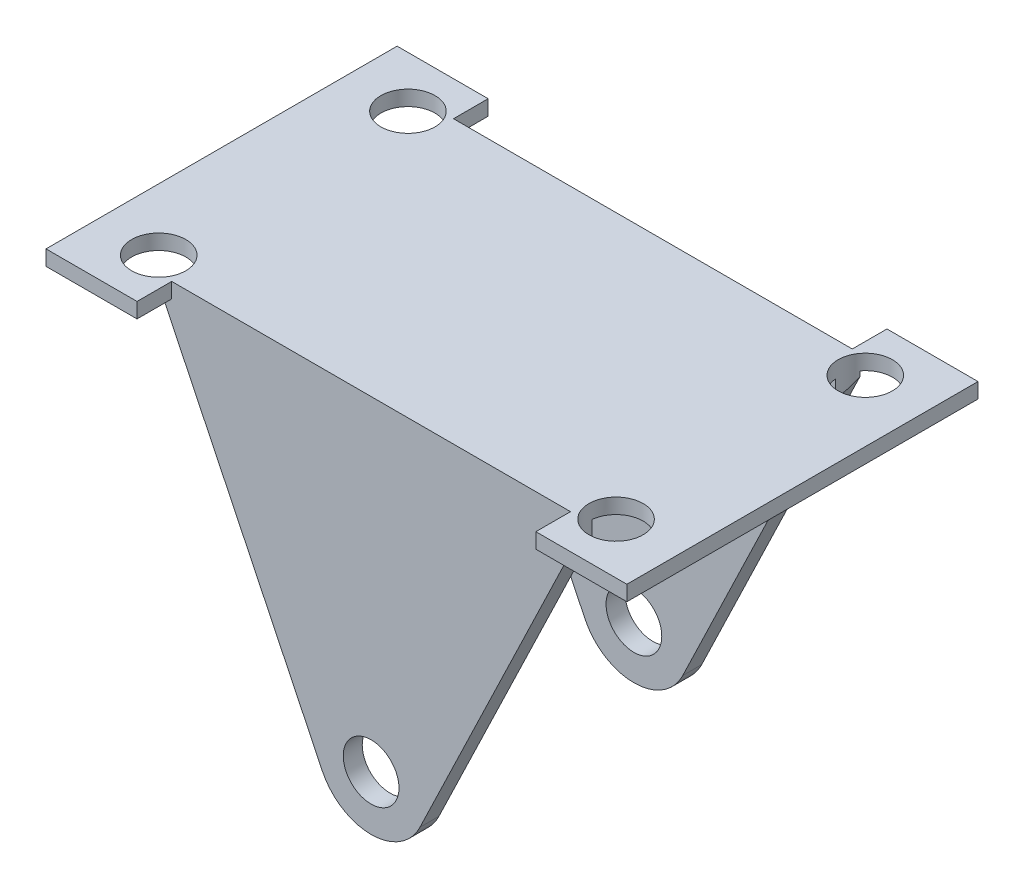
ISO-10303-21;
HEADER;
FILE_DESCRIPTION(('STEP AP214'),'2;1');
FILE_NAME('part.step','',(''),(''),'','','');
FILE_SCHEMA(('AUTOMOTIVE_DESIGN { 1 0 10303 214 1 1 1 1 }'));
ENDSEC;
DATA;
#1=APPLICATION_CONTEXT('core data for automotive mechanical design processes');
#2=APPLICATION_PROTOCOL_DEFINITION('international standard','automotive_design',2000,#1);
#3=PRODUCT_CONTEXT('',#1,'mechanical');
#4=PRODUCT('Part','Part','',(#3));
#5=PRODUCT_RELATED_PRODUCT_CATEGORY('part','',(#4));
#6=PRODUCT_DEFINITION_FORMATION('','',#4);
#7=PRODUCT_DEFINITION_CONTEXT('part definition',#1,'design');
#8=PRODUCT_DEFINITION('design','',#6,#7);
#9=PRODUCT_DEFINITION_SHAPE('','',#8);
#10=(LENGTH_UNIT() NAMED_UNIT(*) SI_UNIT(.MILLI.,.METRE.));
#11=(NAMED_UNIT(*) PLANE_ANGLE_UNIT() SI_UNIT($,.RADIAN.));
#12=(NAMED_UNIT(*) SI_UNIT($,.STERADIAN.) SOLID_ANGLE_UNIT());
#13=UNCERTAINTY_MEASURE_WITH_UNIT(LENGTH_MEASURE(1.E-05),#10,'distance_accuracy_value','');
#14=(GEOMETRIC_REPRESENTATION_CONTEXT(3) GLOBAL_UNCERTAINTY_ASSIGNED_CONTEXT((#13)) GLOBAL_UNIT_ASSIGNED_CONTEXT((#10,
#11,#12)) REPRESENTATION_CONTEXT('',''));
#15=CARTESIAN_POINT('',(0.,0.,0.));
#16=DIRECTION('',(0.,0.,1.));
#17=DIRECTION('',(1.,0.,0.));
#18=AXIS2_PLACEMENT_3D('',#15,#16,#17);
#19=CARTESIAN_POINT('',(-25.4,19.05,16.51));
#20=DIRECTION('',(0.900934049447252,0.433956032964834,0.));
#21=DIRECTION('',(-0.433956032964834,0.900934049447252,0.));
#22=AXIS2_PLACEMENT_3D('',#19,#20,#21);
#23=PLANE('',#22);
#24=DIRECTION('',(-0.433956032964834,0.900934049447252,0.));
#25=VECTOR('',#24,1.);
#26=CARTESIAN_POINT('',(-25.4,19.05,14.2875));
#27=LINE('',#26,#25);
#28=CARTESIAN_POINT('',(-5.72093121399006,-21.8056208093267,14.2875));
#29=VERTEX_POINT('',#28);
#30=CARTESIAN_POINT('',(-23.6377976710924,15.3915001531808,14.2875));
#31=VERTEX_POINT('',#30);
#32=EDGE_CURVE('E213',#29,#31,#27,.T.);
#33=ORIENTED_EDGE('',*,*,#32,.F.);
#34=DIRECTION('',(0.,0.,-1.));
#35=VECTOR('',#34,1.);
#36=CARTESIAN_POINT('',(-5.72093121399006,-21.8056208093267,16.51));
#37=LINE('',#36,#35);
#38=CARTESIAN_POINT('',(-5.72093121399006,-21.8056208093267,16.51));
#39=VERTEX_POINT('',#38);
#40=EDGE_CURVE('E383',#39,#29,#37,.T.);
#41=ORIENTED_EDGE('',*,*,#40,.F.);
#42=DIRECTION('',(0.433956032964834,-0.900934049447252,0.));
#43=VECTOR('',#42,1.);
#44=CARTESIAN_POINT('',(-25.4,19.05,16.51));
#45=LINE('',#44,#43);
#46=CARTESIAN_POINT('',(-24.2578767629152,16.67884339705,16.51));
#47=VERTEX_POINT('',#46);
#48=EDGE_CURVE('E359',#47,#39,#45,.T.);
#49=ORIENTED_EDGE('',*,*,#48,.F.);
#50=CARTESIAN_POINT('',(-26.797,21.9503050343117,14.6038315428861));
#51=DIRECTION('',(0.900934049447252,0.433956032964834,0.));
#52=DIRECTION('',(-0.433956032964834,0.900934049447252,0.));
#53=AXIS2_PLACEMENT_3D('',#50,#51,#52);
#54=ELLIPSE('',#53,7.31640940283294,3.17499999999999);
#55=EDGE_CURVE('E250',#47,#31,#54,.T.);
#56=ORIENTED_EDGE('',*,*,#55,.T.);
#57=EDGE_LOOP('',(#33,#41,#49,#56));
#58=FACE_BOUND('',#57,.T.);
#59=ADVANCED_FACE('F34',(#58),#23,.F.);
#60=CARTESIAN_POINT('',(0.,-19.05,16.51));
#61=DIRECTION('',(0.,0.,-1.));
#62=DIRECTION('',(-1.,0.,0.));
#63=AXIS2_PLACEMENT_3D('',#60,#61,#62);
#64=CYLINDRICAL_SURFACE('',#63,6.35);
#65=CARTESIAN_POINT('',(0.,-19.05,14.2875));
#66=DIRECTION('',(0.,0.,-1.));
#67=DIRECTION('',(-1.,0.,0.));
#68=AXIS2_PLACEMENT_3D('',#65,#66,#67);
#69=CIRCLE('',#68,6.35);
#70=CARTESIAN_POINT('',(5.72093121399004,-21.8056208093267,14.2875));
#71=VERTEX_POINT('',#70);
#72=EDGE_CURVE('E232',#71,#29,#69,.T.);
#73=ORIENTED_EDGE('',*,*,#72,.F.);
#74=DIRECTION('',(0.,0.,-1.));
#75=VECTOR('',#74,1.);
#76=CARTESIAN_POINT('',(5.72093121399004,-21.8056208093267,16.51));
#77=LINE('',#76,#75);
#78=CARTESIAN_POINT('',(5.72093121399004,-21.8056208093267,16.51));
#79=VERTEX_POINT('',#78);
#80=EDGE_CURVE('E379',#79,#71,#77,.T.);
#81=ORIENTED_EDGE('',*,*,#80,.F.);
#82=CARTESIAN_POINT('',(0.,-19.05,16.51));
#83=DIRECTION('',(0.,0.,1.));
#84=DIRECTION('',(1.,0.,0.));
#85=AXIS2_PLACEMENT_3D('',#82,#83,#84);
#86=CIRCLE('',#85,6.35);
#87=EDGE_CURVE('E362',#39,#79,#86,.T.);
#88=ORIENTED_EDGE('',*,*,#87,.F.);
#89=ORIENTED_EDGE('',*,*,#40,.T.);
#90=EDGE_LOOP('',(#73,#81,#88,#89));
#91=FACE_BOUND('',#90,.T.);
#92=ADVANCED_FACE('F459',(#91),#64,.T.);
#93=CARTESIAN_POINT('',(5.72093121399004,-21.8056208093267,16.51));
#94=DIRECTION('',(-0.900934049447252,0.433956032964835,0.));
#95=DIRECTION('',(-0.433956032964835,-0.900934049447252,0.));
#96=AXIS2_PLACEMENT_3D('',#93,#94,#95);
#97=PLANE('',#96);
#98=DIRECTION('',(-0.433956032964835,-0.900934049447252,0.));
#99=VECTOR('',#98,1.);
#100=CARTESIAN_POINT('',(5.72093121399004,-21.8056208093267,14.2875));
#101=LINE('',#100,#99);
#102=CARTESIAN_POINT('',(23.6377976710924,15.3915001531808,14.2875));
#103=VERTEX_POINT('',#102);
#104=EDGE_CURVE('E234',#103,#71,#101,.T.);
#105=ORIENTED_EDGE('',*,*,#104,.F.);
#106=CARTESIAN_POINT('',(26.797,21.9503050343116,14.6038315428861));
#107=DIRECTION('',(-0.900934049447252,0.433956032964835,0.));
#108=DIRECTION('',(0.433956032964835,0.900934049447252,0.));
#109=AXIS2_PLACEMENT_3D('',#106,#107,#108);
#110=ELLIPSE('',#109,7.31640940283292,3.17499999999999);
#111=CARTESIAN_POINT('',(24.2578767629152,16.6788433970499,16.51));
#112=VERTEX_POINT('',#111);
#113=EDGE_CURVE('E259',#103,#112,#110,.T.);
#114=ORIENTED_EDGE('',*,*,#113,.T.);
#115=DIRECTION('',(0.433956032964835,0.900934049447252,0.));
#116=VECTOR('',#115,1.);
#117=CARTESIAN_POINT('',(5.72093121399004,-21.8056208093267,16.51));
#118=LINE('',#117,#116);
#119=EDGE_CURVE('E364',#79,#112,#118,.T.);
#120=ORIENTED_EDGE('',*,*,#119,.F.);
#121=ORIENTED_EDGE('',*,*,#80,.T.);
#122=EDGE_LOOP('',(#105,#114,#120,#121));
#123=FACE_BOUND('',#122,.T.);
#124=ADVANCED_FACE('F464',(#123),#97,.F.);
#125=CARTESIAN_POINT('',(25.4,19.05,16.51));
#126=DIRECTION('',(0.,-1.,0.));
#127=DIRECTION('',(1.,0.,0.));
#128=AXIS2_PLACEMENT_3D('',#125,#126,#127);
#129=PLANE('',#128);
#130=CARTESIAN_POINT('',(-26.797,19.05,-14.6038315428861));
#131=DIRECTION('',(0.,1.,0.));
#132=DIRECTION('',(0.,0.,1.));
#133=AXIS2_PLACEMENT_3D('',#130,#131,#132);
#134=CIRCLE('',#133,3.175);
#135=CARTESIAN_POINT('',(-26.797,19.05,-11.4288315428861));
#136=VERTEX_POINT('',#135);
#137=EDGE_CURVE('E238',#136,#136,#134,.T.);
#138=ORIENTED_EDGE('',*,*,#137,.F.);
#139=EDGE_LOOP('',(#138));
#140=FACE_BOUND('',#139,.T.);
#141=CARTESIAN_POINT('',(-26.797,19.05,14.6038315428861));
#142=DIRECTION('',(0.,1.,0.));
#143=DIRECTION('',(0.,0.,1.));
#144=AXIS2_PLACEMENT_3D('',#141,#142,#143);
#145=CIRCLE('',#144,3.175);
#146=CARTESIAN_POINT('',(-26.797,19.05,17.7788315428861));
#147=VERTEX_POINT('',#146);
#148=EDGE_CURVE('E246',#147,#147,#145,.T.);
#149=ORIENTED_EDGE('',*,*,#148,.F.);
#150=EDGE_LOOP('',(#149));
#151=FACE_BOUND('',#150,.T.);
#152=CARTESIAN_POINT('',(26.797,19.05,14.6038315428861));
#153=DIRECTION('',(0.,1.,0.));
#154=DIRECTION('',(0.,0.,1.));
#155=AXIS2_PLACEMENT_3D('',#152,#153,#154);
#156=CIRCLE('',#155,3.175);
#157=CARTESIAN_POINT('',(26.797,19.05,17.7788315428861));
#158=VERTEX_POINT('',#157);
#159=EDGE_CURVE('E253',#158,#158,#156,.T.);
#160=ORIENTED_EDGE('',*,*,#159,.F.);
#161=EDGE_LOOP('',(#160));
#162=FACE_BOUND('',#161,.T.);
#163=CARTESIAN_POINT('',(26.797,19.05,-14.6038315428861));
#164=DIRECTION('',(0.,1.,0.));
#165=DIRECTION('',(0.,0.,1.));
#166=AXIS2_PLACEMENT_3D('',#163,#164,#165);
#167=CIRCLE('',#166,3.175);
#168=CARTESIAN_POINT('',(26.797,19.05,-11.4288315428861));
#169=VERTEX_POINT('',#168);
#170=EDGE_CURVE('E205',#169,#169,#167,.T.);
#171=ORIENTED_EDGE('',*,*,#170,.F.);
#172=EDGE_LOOP('',(#171));
#173=FACE_BOUND('',#172,.T.);
#174=DIRECTION('',(0.,0.,-1.));
#175=VECTOR('',#174,1.);
#176=CARTESIAN_POINT('',(-23.368,19.05,16.51));
#177=LINE('',#176,#175);
#178=CARTESIAN_POINT('',(-23.368,19.05,20.574));
#179=VERTEX_POINT('',#178);
#180=CARTESIAN_POINT('',(-23.368,19.05,16.51));
#181=VERTEX_POINT('',#180);
#182=EDGE_CURVE('E310',#179,#181,#177,.T.);
#183=ORIENTED_EDGE('',*,*,#182,.T.);
#184=DIRECTION('',(-1.,0.,0.));
#185=VECTOR('',#184,1.);
#186=CARTESIAN_POINT('',(25.4,19.05,16.51));
#187=LINE('',#186,#185);
#188=CARTESIAN_POINT('',(23.368,19.05,16.51));
#189=VERTEX_POINT('',#188);
#190=EDGE_CURVE('E356',#189,#181,#187,.T.);
#191=ORIENTED_EDGE('',*,*,#190,.F.);
#192=DIRECTION('',(0.,0.,1.));
#193=VECTOR('',#192,1.);
#194=CARTESIAN_POINT('',(23.368,19.05,16.51));
#195=LINE('',#194,#193);
#196=CARTESIAN_POINT('',(23.368,19.05,20.574));
#197=VERTEX_POINT('',#196);
#198=EDGE_CURVE('E313',#189,#197,#195,.T.);
#199=ORIENTED_EDGE('',*,*,#198,.T.);
#200=DIRECTION('',(1.,0.,0.));
#201=VECTOR('',#200,1.);
#202=CARTESIAN_POINT('',(23.368,19.05,20.574));
#203=LINE('',#202,#201);
#204=CARTESIAN_POINT('',(34.036,19.05,20.574));
#205=VERTEX_POINT('',#204);
#206=EDGE_CURVE('E316',#197,#205,#203,.T.);
#207=ORIENTED_EDGE('',*,*,#206,.T.);
#208=DIRECTION('',(0.,0.,-1.));
#209=VECTOR('',#208,1.);
#210=CARTESIAN_POINT('',(34.036,19.05,20.574));
#211=LINE('',#210,#209);
#212=CARTESIAN_POINT('',(34.036,19.05,-20.574));
#213=VERTEX_POINT('',#212);
#214=EDGE_CURVE('E319',#205,#213,#211,.T.);
#215=ORIENTED_EDGE('',*,*,#214,.T.);
#216=DIRECTION('',(-1.,0.,0.));
#217=VECTOR('',#216,1.);
#218=CARTESIAN_POINT('',(34.036,19.05,-20.574));
#219=LINE('',#218,#217);
#220=CARTESIAN_POINT('',(23.368,19.05,-20.574));
#221=VERTEX_POINT('',#220);
#222=EDGE_CURVE('E322',#213,#221,#219,.T.);
#223=ORIENTED_EDGE('',*,*,#222,.T.);
#224=DIRECTION('',(0.,0.,1.));
#225=VECTOR('',#224,1.);
#226=CARTESIAN_POINT('',(23.368,19.05,-20.574));
#227=LINE('',#226,#225);
#228=CARTESIAN_POINT('',(23.368,19.05,-16.51));
#229=VERTEX_POINT('',#228);
#230=EDGE_CURVE('E271',#221,#229,#227,.T.);
#231=ORIENTED_EDGE('',*,*,#230,.T.);
#232=DIRECTION('',(-1.,0.,0.));
#233=VECTOR('',#232,1.);
#234=CARTESIAN_POINT('',(25.4,19.05,-16.51));
#235=LINE('',#234,#233);
#236=CARTESIAN_POINT('',(-23.368,19.05,-16.51));
#237=VERTEX_POINT('',#236);
#238=EDGE_CURVE('E368',#229,#237,#235,.T.);
#239=ORIENTED_EDGE('',*,*,#238,.T.);
#240=DIRECTION('',(0.,0.,-1.));
#241=VECTOR('',#240,1.);
#242=CARTESIAN_POINT('',(-23.368,19.05,-20.574));
#243=LINE('',#242,#241);
#244=CARTESIAN_POINT('',(-23.368,19.05,-20.574));
#245=VERTEX_POINT('',#244);
#246=EDGE_CURVE('E266',#237,#245,#243,.T.);
#247=ORIENTED_EDGE('',*,*,#246,.T.);
#248=DIRECTION('',(-1.,0.,0.));
#249=VECTOR('',#248,1.);
#250=CARTESIAN_POINT('',(-34.036,19.05,-20.574));
#251=LINE('',#250,#249);
#252=CARTESIAN_POINT('',(-34.036,19.05,-20.574));
#253=VERTEX_POINT('',#252);
#254=EDGE_CURVE('E301',#245,#253,#251,.T.);
#255=ORIENTED_EDGE('',*,*,#254,.T.);
#256=DIRECTION('',(0.,0.,1.));
#257=VECTOR('',#256,1.);
#258=CARTESIAN_POINT('',(-34.036,19.05,20.574));
#259=LINE('',#258,#257);
#260=CARTESIAN_POINT('',(-34.036,19.05,20.574));
#261=VERTEX_POINT('',#260);
#262=EDGE_CURVE('E304',#253,#261,#259,.T.);
#263=ORIENTED_EDGE('',*,*,#262,.T.);
#264=DIRECTION('',(1.,0.,0.));
#265=VECTOR('',#264,1.);
#266=CARTESIAN_POINT('',(-23.368,19.05,20.574));
#267=LINE('',#266,#265);
#268=EDGE_CURVE('E307',#261,#179,#267,.T.);
#269=ORIENTED_EDGE('',*,*,#268,.T.);
#270=EDGE_LOOP('',(#183,#191,#199,#207,#215,#223,#231,#239,#247,#255,#263,#269));
#271=FACE_BOUND('',#270,.T.);
#272=ADVANCED_FACE('F36',(#140,#151,#162,#173,#271),#129,.F.);
#273=CARTESIAN_POINT('',(-5.72093121399006,-21.8056208093267,-14.2875));
#274=VERTEX_POINT('',#273);
#275=CARTESIAN_POINT('',(-5.72093121399006,-21.8056208093267,-16.51));
#276=VERTEX_POINT('',#275);
#277=EDGE_CURVE('E382',#274,#276,#37,.T.);
#278=ORIENTED_EDGE('',*,*,#277,.F.);
#279=DIRECTION('',(-0.433956032964834,0.900934049447252,0.));
#280=VECTOR('',#279,1.);
#281=CARTESIAN_POINT('',(-25.4,19.05,-14.2875));
#282=LINE('',#281,#280);
#283=CARTESIAN_POINT('',(-23.6377976710924,15.3915001531808,-14.2875));
#284=VERTEX_POINT('',#283);
#285=EDGE_CURVE('E216',#274,#284,#282,.T.);
#286=ORIENTED_EDGE('',*,*,#285,.T.);
#287=CARTESIAN_POINT('',(-26.797,21.9503050343117,-14.6038315428861));
#288=DIRECTION('',(0.900934049447252,0.433956032964834,0.));
#289=DIRECTION('',(-0.433956032964834,0.900934049447252,0.));
#290=AXIS2_PLACEMENT_3D('',#287,#288,#289);
#291=ELLIPSE('',#290,7.31640940283294,3.17499999999999);
#292=CARTESIAN_POINT('',(-24.2578767629152,16.67884339705,-16.51));
#293=VERTEX_POINT('',#292);
#294=EDGE_CURVE('E244',#284,#293,#291,.T.);
#295=ORIENTED_EDGE('',*,*,#294,.T.);
#296=DIRECTION('',(0.433956032964834,-0.900934049447252,0.));
#297=VECTOR('',#296,1.);
#298=CARTESIAN_POINT('',(-25.4,19.05,-16.51));
#299=LINE('',#298,#297);
#300=EDGE_CURVE('E371',#293,#276,#299,.T.);
#301=ORIENTED_EDGE('',*,*,#300,.T.);
#302=EDGE_LOOP('',(#278,#286,#295,#301));
#303=FACE_BOUND('',#302,.T.);
#304=ADVANCED_FACE('F400',(#303),#23,.F.);
#305=CARTESIAN_POINT('',(5.72093121399004,-21.8056208093267,-14.2875));
#306=VERTEX_POINT('',#305);
#307=CARTESIAN_POINT('',(5.72093121399004,-21.8056208093267,-16.51));
#308=VERTEX_POINT('',#307);
#309=EDGE_CURVE('E367',#306,#308,#77,.T.);
#310=ORIENTED_EDGE('',*,*,#309,.F.);
#311=CARTESIAN_POINT('',(0.,-19.05,-14.2875));
#312=DIRECTION('',(0.,0.,-1.));
#313=DIRECTION('',(-1.,0.,0.));
#314=AXIS2_PLACEMENT_3D('',#311,#312,#313);
#315=CIRCLE('',#314,6.35);
#316=EDGE_CURVE('E220',#306,#274,#315,.T.);
#317=ORIENTED_EDGE('',*,*,#316,.T.);
#318=ORIENTED_EDGE('',*,*,#277,.T.);
#319=CARTESIAN_POINT('',(0.,-19.05,-16.51));
#320=DIRECTION('',(0.,0.,1.));
#321=DIRECTION('',(1.,0.,0.));
#322=AXIS2_PLACEMENT_3D('',#319,#320,#321);
#323=CIRCLE('',#322,6.35);
#324=EDGE_CURVE('E374',#276,#308,#323,.T.);
#325=ORIENTED_EDGE('',*,*,#324,.T.);
#326=EDGE_LOOP('',(#310,#317,#318,#325));
#327=FACE_BOUND('',#326,.T.);
#328=ADVANCED_FACE('F405',(#327),#64,.T.);
#329=CARTESIAN_POINT('',(26.797,21.9503050343116,-14.6038315428861));
#330=DIRECTION('',(-0.900934049447252,0.433956032964835,0.));
#331=DIRECTION('',(0.433956032964835,0.900934049447252,0.));
#332=AXIS2_PLACEMENT_3D('',#329,#330,#331);
#333=ELLIPSE('',#332,7.31640940283292,3.17499999999999);
#334=CARTESIAN_POINT('',(24.2578767629152,16.6788433970499,-16.51));
#335=VERTEX_POINT('',#334);
#336=CARTESIAN_POINT('',(23.6377976710924,15.3915001531808,-14.2875));
#337=VERTEX_POINT('',#336);
#338=EDGE_CURVE('E264',#335,#337,#333,.T.);
#339=ORIENTED_EDGE('',*,*,#338,.T.);
#340=DIRECTION('',(-0.433956032964835,-0.900934049447252,0.));
#341=VECTOR('',#340,1.);
#342=CARTESIAN_POINT('',(5.72093121399004,-21.8056208093267,-14.2875));
#343=LINE('',#342,#341);
#344=EDGE_CURVE('E212',#337,#306,#343,.T.);
#345=ORIENTED_EDGE('',*,*,#344,.T.);
#346=ORIENTED_EDGE('',*,*,#309,.T.);
#347=DIRECTION('',(0.433956032964835,0.900934049447252,0.));
#348=VECTOR('',#347,1.);
#349=CARTESIAN_POINT('',(5.72093121399004,-21.8056208093267,-16.51));
#350=LINE('',#349,#348);
#351=EDGE_CURVE('E360',#308,#335,#350,.T.);
#352=ORIENTED_EDGE('',*,*,#351,.T.);
#353=EDGE_LOOP('',(#339,#345,#346,#352));
#354=FACE_BOUND('',#353,.T.);
#355=ADVANCED_FACE('F408',(#354),#97,.F.);
#356=CARTESIAN_POINT('',(0.,-19.05,16.51));
#357=DIRECTION('',(0.,0.,1.));
#358=DIRECTION('',(1.,0.,0.));
#359=AXIS2_PLACEMENT_3D('',#356,#357,#358);
#360=PLANE('',#359);
#361=CARTESIAN_POINT('',(0.,-19.05,16.51));
#362=DIRECTION('',(0.,0.,1.));
#363=DIRECTION('',(1.,0.,0.));
#364=AXIS2_PLACEMENT_3D('',#361,#362,#363);
#365=CIRCLE('',#364,3.2639);
#366=CARTESIAN_POINT('',(3.26389999999999,-19.05,16.51));
#367=VERTEX_POINT('',#366);
#368=EDGE_CURVE('E528',#367,#367,#365,.T.);
#369=ORIENTED_EDGE('',*,*,#368,.F.);
#370=EDGE_LOOP('',(#369));
#371=FACE_BOUND('',#370,.T.);
#372=DIRECTION('',(0.,1.,0.));
#373=VECTOR('',#372,1.);
#374=CARTESIAN_POINT('',(-24.2578767629152,19.05,16.51));
#375=LINE('',#374,#373);
#376=CARTESIAN_POINT('',(-24.2578767629152,17.272,16.51));
#377=VERTEX_POINT('',#376);
#378=EDGE_CURVE('E58',#47,#377,#375,.T.);
#379=ORIENTED_EDGE('',*,*,#378,.F.);
#380=ORIENTED_EDGE('',*,*,#48,.T.);
#381=ORIENTED_EDGE('',*,*,#87,.T.);
#382=ORIENTED_EDGE('',*,*,#119,.T.);
#383=DIRECTION('',(0.,1.,0.));
#384=VECTOR('',#383,1.);
#385=CARTESIAN_POINT('',(24.2578767629152,19.05,16.51));
#386=LINE('',#385,#384);
#387=CARTESIAN_POINT('',(24.2578767629152,17.272,16.51));
#388=VERTEX_POINT('',#387);
#389=EDGE_CURVE('E256',#388,#112,#386,.F.);
#390=ORIENTED_EDGE('',*,*,#389,.F.);
#391=DIRECTION('',(1.,0.,0.));
#392=VECTOR('',#391,1.);
#393=CARTESIAN_POINT('',(0.,17.272,16.51));
#394=LINE('',#393,#392);
#395=CARTESIAN_POINT('',(23.368,17.272,16.51));
#396=VERTEX_POINT('',#395);
#397=EDGE_CURVE('E329',#396,#388,#394,.T.);
#398=ORIENTED_EDGE('',*,*,#397,.F.);
#399=DIRECTION('',(0.,1.,0.));
#400=VECTOR('',#399,1.);
#401=CARTESIAN_POINT('',(23.368,17.272,16.51));
#402=LINE('',#401,#400);
#403=EDGE_CURVE('E338',#396,#189,#402,.T.);
#404=ORIENTED_EDGE('',*,*,#403,.T.);
#405=ORIENTED_EDGE('',*,*,#190,.T.);
#406=DIRECTION('',(0.,1.,0.));
#407=VECTOR('',#406,1.);
#408=CARTESIAN_POINT('',(-23.368,17.272,16.51));
#409=LINE('',#408,#407);
#410=CARTESIAN_POINT('',(-23.368,17.272,16.51));
#411=VERTEX_POINT('',#410);
#412=EDGE_CURVE('E341',#411,#181,#409,.T.);
#413=ORIENTED_EDGE('',*,*,#412,.F.);
#414=EDGE_CURVE('E355',#377,#411,#394,.T.);
#415=ORIENTED_EDGE('',*,*,#414,.F.);
#416=EDGE_LOOP('',(#379,#380,#381,#382,#390,#398,#404,#405,#413,#415));
#417=FACE_BOUND('',#416,.T.);
#418=ADVANCED_FACE('F435',(#371,#417),#360,.T.);
#419=CARTESIAN_POINT('',(0.,-19.05,-16.51));
#420=DIRECTION('',(0.,0.,1.));
#421=DIRECTION('',(1.,0.,0.));
#422=AXIS2_PLACEMENT_3D('',#419,#420,#421);
#423=PLANE('',#422);
#424=CARTESIAN_POINT('',(0.,-19.05,-16.51));
#425=DIRECTION('',(0.,0.,1.));
#426=DIRECTION('',(1.,0.,0.));
#427=AXIS2_PLACEMENT_3D('',#424,#425,#426);
#428=CIRCLE('',#427,3.26389999999999);
#429=CARTESIAN_POINT('',(3.26389999999999,-19.05,-16.51));
#430=VERTEX_POINT('',#429);
#431=EDGE_CURVE('E223',#430,#430,#428,.T.);
#432=ORIENTED_EDGE('',*,*,#431,.T.);
#433=EDGE_LOOP('',(#432));
#434=FACE_BOUND('',#433,.T.);
#435=ORIENTED_EDGE('',*,*,#300,.F.);
#436=DIRECTION('',(0.,1.,0.));
#437=VECTOR('',#436,1.);
#438=CARTESIAN_POINT('',(-24.2578767629152,19.05,-16.51));
#439=LINE('',#438,#437);
#440=CARTESIAN_POINT('',(-24.2578767629152,17.272,-16.51));
#441=VERTEX_POINT('',#440);
#442=EDGE_CURVE('E241',#293,#441,#439,.T.);
#443=ORIENTED_EDGE('',*,*,#442,.T.);
#444=DIRECTION('',(1.,0.,0.));
#445=VECTOR('',#444,1.);
#446=CARTESIAN_POINT('',(0.,17.272,-16.51));
#447=LINE('',#446,#445);
#448=CARTESIAN_POINT('',(-23.368,17.272,-16.51));
#449=VERTEX_POINT('',#448);
#450=EDGE_CURVE('E388',#441,#449,#447,.T.);
#451=ORIENTED_EDGE('',*,*,#450,.T.);
#452=DIRECTION('',(0.,1.,0.));
#453=VECTOR('',#452,1.);
#454=CARTESIAN_POINT('',(-23.368,17.272,-16.51));
#455=LINE('',#454,#453);
#456=EDGE_CURVE('E298',#449,#237,#455,.T.);
#457=ORIENTED_EDGE('',*,*,#456,.T.);
#458=ORIENTED_EDGE('',*,*,#238,.F.);
#459=DIRECTION('',(0.,1.,0.));
#460=VECTOR('',#459,1.);
#461=CARTESIAN_POINT('',(23.368,17.272,-16.51));
#462=LINE('',#461,#460);
#463=CARTESIAN_POINT('',(23.368,17.272,-16.51));
#464=VERTEX_POINT('',#463);
#465=EDGE_CURVE('E326',#464,#229,#462,.T.);
#466=ORIENTED_EDGE('',*,*,#465,.F.);
#467=CARTESIAN_POINT('',(24.2578767629152,17.272,-16.51));
#468=VERTEX_POINT('',#467);
#469=EDGE_CURVE('E386',#464,#468,#447,.T.);
#470=ORIENTED_EDGE('',*,*,#469,.T.);
#471=DIRECTION('',(0.,1.,0.));
#472=VECTOR('',#471,1.);
#473=CARTESIAN_POINT('',(24.2578767629152,19.05,-16.51));
#474=LINE('',#473,#472);
#475=EDGE_CURVE('E203',#468,#335,#474,.F.);
#476=ORIENTED_EDGE('',*,*,#475,.T.);
#477=ORIENTED_EDGE('',*,*,#351,.F.);
#478=ORIENTED_EDGE('',*,*,#324,.F.);
#479=EDGE_LOOP('',(#435,#443,#451,#457,#458,#466,#470,#476,#477,#478));
#480=FACE_BOUND('',#479,.T.);
#481=ADVANCED_FACE('F410',(#434,#480),#423,.F.);
#482=CARTESIAN_POINT('',(34.036,17.272,-20.574));
#483=DIRECTION('',(0.,0.,-1.));
#484=DIRECTION('',(-1.,0.,0.));
#485=AXIS2_PLACEMENT_3D('',#482,#483,#484);
#486=PLANE('',#485);
#487=ORIENTED_EDGE('',*,*,#222,.F.);
#488=DIRECTION('',(0.,1.,0.));
#489=VECTOR('',#488,1.);
#490=CARTESIAN_POINT('',(34.036,17.272,-20.574));
#491=LINE('',#490,#489);
#492=CARTESIAN_POINT('',(34.036,17.272,-20.574));
#493=VERTEX_POINT('',#492);
#494=EDGE_CURVE('E332',#493,#213,#491,.T.);
#495=ORIENTED_EDGE('',*,*,#494,.F.);
#496=DIRECTION('',(-1.,0.,0.));
#497=VECTOR('',#496,1.);
#498=CARTESIAN_POINT('',(34.036,17.272,-20.574));
#499=LINE('',#498,#497);
#500=CARTESIAN_POINT('',(23.368,17.272,-20.574));
#501=VERTEX_POINT('',#500);
#502=EDGE_CURVE('E292',#493,#501,#499,.T.);
#503=ORIENTED_EDGE('',*,*,#502,.T.);
#504=DIRECTION('',(0.,1.,0.));
#505=VECTOR('',#504,1.);
#506=CARTESIAN_POINT('',(23.368,17.272,-20.574));
#507=LINE('',#506,#505);
#508=EDGE_CURVE('E330',#501,#221,#507,.T.);
#509=ORIENTED_EDGE('',*,*,#508,.T.);
#510=EDGE_LOOP('',(#487,#495,#503,#509));
#511=FACE_BOUND('',#510,.T.);
#512=ADVANCED_FACE('F420',(#511),#486,.T.);
#513=CARTESIAN_POINT('',(34.036,17.272,20.574));
#514=DIRECTION('',(1.,0.,0.));
#515=DIRECTION('',(0.,0.,-1.));
#516=AXIS2_PLACEMENT_3D('',#513,#514,#515);
#517=PLANE('',#516);
#518=ORIENTED_EDGE('',*,*,#214,.F.);
#519=DIRECTION('',(0.,1.,0.));
#520=VECTOR('',#519,1.);
#521=CARTESIAN_POINT('',(34.036,17.272,20.574));
#522=LINE('',#521,#520);
#523=CARTESIAN_POINT('',(34.036,17.272,20.574));
#524=VERTEX_POINT('',#523);
#525=EDGE_CURVE('E334',#524,#205,#522,.T.);
#526=ORIENTED_EDGE('',*,*,#525,.F.);
#527=DIRECTION('',(0.,0.,-1.));
#528=VECTOR('',#527,1.);
#529=CARTESIAN_POINT('',(34.036,17.272,20.574));
#530=LINE('',#529,#528);
#531=EDGE_CURVE('E289',#524,#493,#530,.T.);
#532=ORIENTED_EDGE('',*,*,#531,.T.);
#533=ORIENTED_EDGE('',*,*,#494,.T.);
#534=EDGE_LOOP('',(#518,#526,#532,#533));
#535=FACE_BOUND('',#534,.T.);
#536=ADVANCED_FACE('F425',(#535),#517,.T.);
#537=CARTESIAN_POINT('',(23.368,17.272,20.574));
#538=DIRECTION('',(0.,0.,1.));
#539=DIRECTION('',(1.,0.,0.));
#540=AXIS2_PLACEMENT_3D('',#537,#538,#539);
#541=PLANE('',#540);
#542=ORIENTED_EDGE('',*,*,#206,.F.);
#543=DIRECTION('',(0.,1.,0.));
#544=VECTOR('',#543,1.);
#545=CARTESIAN_POINT('',(23.368,17.272,20.574));
#546=LINE('',#545,#544);
#547=CARTESIAN_POINT('',(23.368,17.272,20.574));
#548=VERTEX_POINT('',#547);
#549=EDGE_CURVE('E336',#548,#197,#546,.T.);
#550=ORIENTED_EDGE('',*,*,#549,.F.);
#551=DIRECTION('',(1.,0.,0.));
#552=VECTOR('',#551,1.);
#553=CARTESIAN_POINT('',(23.368,17.272,20.574));
#554=LINE('',#553,#552);
#555=EDGE_CURVE('E286',#548,#524,#554,.T.);
#556=ORIENTED_EDGE('',*,*,#555,.T.);
#557=ORIENTED_EDGE('',*,*,#525,.T.);
#558=EDGE_LOOP('',(#542,#550,#556,#557));
#559=FACE_BOUND('',#558,.T.);
#560=ADVANCED_FACE('F428',(#559),#541,.T.);
#561=CARTESIAN_POINT('',(23.368,17.272,-20.574));
#562=DIRECTION('',(-1.,0.,0.));
#563=DIRECTION('',(0.,-1.,0.));
#564=AXIS2_PLACEMENT_3D('',#561,#562,#563);
#565=PLANE('',#564);
#566=ORIENTED_EDGE('',*,*,#230,.F.);
#567=ORIENTED_EDGE('',*,*,#508,.F.);
#568=DIRECTION('',(0.,0.,1.));
#569=VECTOR('',#568,1.);
#570=CARTESIAN_POINT('',(23.368,17.272,-20.574));
#571=LINE('',#570,#569);
#572=EDGE_CURVE('E295',#501,#464,#571,.T.);
#573=ORIENTED_EDGE('',*,*,#572,.T.);
#574=ORIENTED_EDGE('',*,*,#465,.T.);
#575=EDGE_LOOP('',(#566,#567,#573,#574));
#576=FACE_BOUND('',#575,.T.);
#577=ADVANCED_FACE('F417',(#576),#565,.T.);
#578=CARTESIAN_POINT('',(23.368,17.272,16.51));
#579=DIRECTION('',(-1.,0.,0.));
#580=DIRECTION('',(0.,-1.,0.));
#581=AXIS2_PLACEMENT_3D('',#578,#579,#580);
#582=PLANE('',#581);
#583=ORIENTED_EDGE('',*,*,#198,.F.);
#584=ORIENTED_EDGE('',*,*,#403,.F.);
#585=DIRECTION('',(0.,0.,1.));
#586=VECTOR('',#585,1.);
#587=CARTESIAN_POINT('',(23.368,17.272,16.51));
#588=LINE('',#587,#586);
#589=EDGE_CURVE('E283',#396,#548,#588,.T.);
#590=ORIENTED_EDGE('',*,*,#589,.T.);
#591=ORIENTED_EDGE('',*,*,#549,.T.);
#592=EDGE_LOOP('',(#583,#584,#590,#591));
#593=FACE_BOUND('',#592,.T.);
#594=ADVANCED_FACE('F432',(#593),#582,.T.);
#595=CARTESIAN_POINT('',(0.,17.272,0.));
#596=DIRECTION('',(0.,-1.,0.));
#597=DIRECTION('',(1.,0.,0.));
#598=AXIS2_PLACEMENT_3D('',#595,#596,#597);
#599=PLANE('',#598);
#600=ORIENTED_EDGE('',*,*,#450,.F.);
#601=CARTESIAN_POINT('',(-26.797,17.272,-14.6038315428861));
#602=DIRECTION('',(0.,-1.,0.));
#603=DIRECTION('',(1.,0.,0.));
#604=AXIS2_PLACEMENT_3D('',#601,#602,#603);
#605=CIRCLE('',#604,3.17499999999999);
#606=CARTESIAN_POINT('',(-23.6377976710924,17.272,-14.2875));
#607=VERTEX_POINT('',#606);
#608=EDGE_CURVE('E50',#607,#441,#605,.T.);
#609=ORIENTED_EDGE('',*,*,#608,.F.);
#610=DIRECTION('',(-1.,0.,0.));
#611=VECTOR('',#610,1.);
#612=CARTESIAN_POINT('',(-26.9875,17.272,-14.2875));
#613=LINE('',#612,#611);
#614=CARTESIAN_POINT('',(23.6377976710924,17.272,-14.2875));
#615=VERTEX_POINT('',#614);
#616=EDGE_CURVE('E209',#615,#607,#613,.T.);
#617=ORIENTED_EDGE('',*,*,#616,.F.);
#618=CARTESIAN_POINT('',(26.797,17.272,-14.6038315428861));
#619=DIRECTION('',(0.,-1.,0.));
#620=DIRECTION('',(1.,0.,0.));
#621=AXIS2_PLACEMENT_3D('',#618,#619,#620);
#622=CIRCLE('',#621,3.17499999999999);
#623=EDGE_CURVE('E197',#468,#615,#622,.T.);
#624=ORIENTED_EDGE('',*,*,#623,.F.);
#625=ORIENTED_EDGE('',*,*,#469,.F.);
#626=ORIENTED_EDGE('',*,*,#572,.F.);
#627=ORIENTED_EDGE('',*,*,#502,.F.);
#628=ORIENTED_EDGE('',*,*,#531,.F.);
#629=ORIENTED_EDGE('',*,*,#555,.F.);
#630=ORIENTED_EDGE('',*,*,#589,.F.);
#631=ORIENTED_EDGE('',*,*,#397,.T.);
#632=CARTESIAN_POINT('',(26.797,17.272,14.6038315428861));
#633=DIRECTION('',(0.,-1.,0.));
#634=DIRECTION('',(1.,0.,0.));
#635=AXIS2_PLACEMENT_3D('',#632,#633,#634);
#636=CIRCLE('',#635,3.17499999999999);
#637=CARTESIAN_POINT('',(23.6377976710924,17.272,14.2875));
#638=VERTEX_POINT('',#637);
#639=EDGE_CURVE('E389',#638,#388,#636,.T.);
#640=ORIENTED_EDGE('',*,*,#639,.F.);
#641=DIRECTION('',(-1.,0.,0.));
#642=VECTOR('',#641,1.);
#643=CARTESIAN_POINT('',(-26.9875,17.272,14.2875));
#644=LINE('',#643,#642);
#645=CARTESIAN_POINT('',(-23.6377976710924,17.272,14.2875));
#646=VERTEX_POINT('',#645);
#647=EDGE_CURVE('E217',#638,#646,#644,.T.);
#648=ORIENTED_EDGE('',*,*,#647,.T.);
#649=CARTESIAN_POINT('',(-26.797,17.272,14.6038315428861));
#650=DIRECTION('',(0.,-1.,0.));
#651=DIRECTION('',(1.,0.,0.));
#652=AXIS2_PLACEMENT_3D('',#649,#650,#651);
#653=CIRCLE('',#652,3.17499999999999);
#654=EDGE_CURVE('E391',#377,#646,#653,.T.);
#655=ORIENTED_EDGE('',*,*,#654,.F.);
#656=ORIENTED_EDGE('',*,*,#414,.T.);
#657=DIRECTION('',(0.,0.,-1.));
#658=VECTOR('',#657,1.);
#659=CARTESIAN_POINT('',(-23.368,17.272,16.51));
#660=LINE('',#659,#658);
#661=CARTESIAN_POINT('',(-23.368,17.272,20.574));
#662=VERTEX_POINT('',#661);
#663=EDGE_CURVE('E280',#662,#411,#660,.T.);
#664=ORIENTED_EDGE('',*,*,#663,.F.);
#665=DIRECTION('',(1.,0.,0.));
#666=VECTOR('',#665,1.);
#667=CARTESIAN_POINT('',(-23.368,17.272,20.574));
#668=LINE('',#667,#666);
#669=CARTESIAN_POINT('',(-34.036,17.272,20.574));
#670=VERTEX_POINT('',#669);
#671=EDGE_CURVE('E277',#670,#662,#668,.T.);
#672=ORIENTED_EDGE('',*,*,#671,.F.);
#673=DIRECTION('',(0.,0.,1.));
#674=VECTOR('',#673,1.);
#675=CARTESIAN_POINT('',(-34.036,17.272,20.574));
#676=LINE('',#675,#674);
#677=CARTESIAN_POINT('',(-34.036,17.272,-20.574));
#678=VERTEX_POINT('',#677);
#679=EDGE_CURVE('E274',#678,#670,#676,.T.);
#680=ORIENTED_EDGE('',*,*,#679,.F.);
#681=DIRECTION('',(-1.,0.,0.));
#682=VECTOR('',#681,1.);
#683=CARTESIAN_POINT('',(-34.036,17.272,-20.574));
#684=LINE('',#683,#682);
#685=CARTESIAN_POINT('',(-23.368,17.272,-20.574));
#686=VERTEX_POINT('',#685);
#687=EDGE_CURVE('E270',#686,#678,#684,.T.);
#688=ORIENTED_EDGE('',*,*,#687,.F.);
#689=DIRECTION('',(0.,0.,-1.));
#690=VECTOR('',#689,1.);
#691=CARTESIAN_POINT('',(-23.368,17.272,-20.574));
#692=LINE('',#691,#690);
#693=EDGE_CURVE('E267',#449,#686,#692,.T.);
#694=ORIENTED_EDGE('',*,*,#693,.F.);
#695=EDGE_LOOP('',(#600,#609,#617,#624,#625,#626,#627,#628,#629,#630,#631,#640,#648,#655,#656,
#664,#672,#680,#688,#694));
#696=FACE_BOUND('',#695,.T.);
#697=ADVANCED_FACE('F215',(#696),#599,.T.);
#698=CARTESIAN_POINT('',(-23.368,17.272,16.51));
#699=DIRECTION('',(1.,0.,0.));
#700=DIRECTION('',(0.,1.,0.));
#701=AXIS2_PLACEMENT_3D('',#698,#699,#700);
#702=PLANE('',#701);
#703=ORIENTED_EDGE('',*,*,#182,.F.);
#704=DIRECTION('',(0.,1.,0.));
#705=VECTOR('',#704,1.);
#706=CARTESIAN_POINT('',(-23.368,17.272,20.574));
#707=LINE('',#706,#705);
#708=EDGE_CURVE('E343',#662,#179,#707,.T.);
#709=ORIENTED_EDGE('',*,*,#708,.F.);
#710=ORIENTED_EDGE('',*,*,#663,.T.);
#711=ORIENTED_EDGE('',*,*,#412,.T.);
#712=EDGE_LOOP('',(#703,#709,#710,#711));
#713=FACE_BOUND('',#712,.T.);
#714=ADVANCED_FACE('F442',(#713),#702,.T.);
#715=CARTESIAN_POINT('',(-23.368,17.272,20.574));
#716=DIRECTION('',(0.,0.,1.));
#717=DIRECTION('',(1.,0.,0.));
#718=AXIS2_PLACEMENT_3D('',#715,#716,#717);
#719=PLANE('',#718);
#720=ORIENTED_EDGE('',*,*,#268,.F.);
#721=DIRECTION('',(0.,1.,0.));
#722=VECTOR('',#721,1.);
#723=CARTESIAN_POINT('',(-34.036,17.272,20.574));
#724=LINE('',#723,#722);
#725=EDGE_CURVE('E345',#670,#261,#724,.T.);
#726=ORIENTED_EDGE('',*,*,#725,.F.);
#727=ORIENTED_EDGE('',*,*,#671,.T.);
#728=ORIENTED_EDGE('',*,*,#708,.T.);
#729=EDGE_LOOP('',(#720,#726,#727,#728));
#730=FACE_BOUND('',#729,.T.);
#731=ADVANCED_FACE('F652',(#730),#719,.T.);
#732=CARTESIAN_POINT('',(-34.036,17.272,20.574));
#733=DIRECTION('',(-1.,0.,0.));
#734=DIRECTION('',(0.,0.,1.));
#735=AXIS2_PLACEMENT_3D('',#732,#733,#734);
#736=PLANE('',#735);
#737=ORIENTED_EDGE('',*,*,#262,.F.);
#738=DIRECTION('',(0.,1.,0.));
#739=VECTOR('',#738,1.);
#740=CARTESIAN_POINT('',(-34.036,17.272,-20.574));
#741=LINE('',#740,#739);
#742=EDGE_CURVE('E347',#678,#253,#741,.T.);
#743=ORIENTED_EDGE('',*,*,#742,.F.);
#744=ORIENTED_EDGE('',*,*,#679,.T.);
#745=ORIENTED_EDGE('',*,*,#725,.T.);
#746=EDGE_LOOP('',(#737,#743,#744,#745));
#747=FACE_BOUND('',#746,.T.);
#748=ADVANCED_FACE('F643',(#747),#736,.T.);
#749=CARTESIAN_POINT('',(-34.036,17.272,-20.574));
#750=DIRECTION('',(0.,0.,-1.));
#751=DIRECTION('',(-1.,0.,0.));
#752=AXIS2_PLACEMENT_3D('',#749,#750,#751);
#753=PLANE('',#752);
#754=ORIENTED_EDGE('',*,*,#254,.F.);
#755=DIRECTION('',(0.,1.,0.));
#756=VECTOR('',#755,1.);
#757=CARTESIAN_POINT('',(-23.368,17.272,-20.574));
#758=LINE('',#757,#756);
#759=EDGE_CURVE('E349',#686,#245,#758,.T.);
#760=ORIENTED_EDGE('',*,*,#759,.F.);
#761=ORIENTED_EDGE('',*,*,#687,.T.);
#762=ORIENTED_EDGE('',*,*,#742,.T.);
#763=EDGE_LOOP('',(#754,#760,#761,#762));
#764=FACE_BOUND('',#763,.T.);
#765=ADVANCED_FACE('F635',(#764),#753,.T.);
#766=CARTESIAN_POINT('',(-23.368,17.272,-20.574));
#767=DIRECTION('',(1.,0.,0.));
#768=DIRECTION('',(0.,1.,0.));
#769=AXIS2_PLACEMENT_3D('',#766,#767,#768);
#770=PLANE('',#769);
#771=ORIENTED_EDGE('',*,*,#246,.F.);
#772=ORIENTED_EDGE('',*,*,#456,.F.);
#773=ORIENTED_EDGE('',*,*,#693,.T.);
#774=ORIENTED_EDGE('',*,*,#759,.T.);
#775=EDGE_LOOP('',(#771,#772,#773,#774));
#776=FACE_BOUND('',#775,.T.);
#777=ADVANCED_FACE('F477',(#776),#770,.T.);
#778=CARTESIAN_POINT('',(26.797,19.05,-14.6038315428861));
#779=DIRECTION('',(0.,1.,0.));
#780=DIRECTION('',(0.,0.,1.));
#781=AXIS2_PLACEMENT_3D('',#778,#779,#780);
#782=CYLINDRICAL_SURFACE('',#781,3.17499999999999);
#783=ORIENTED_EDGE('',*,*,#170,.T.);
#784=EDGE_LOOP('',(#783));
#785=FACE_BOUND('',#784,.T.);
#786=ORIENTED_EDGE('',*,*,#623,.T.);
#787=DIRECTION('',(0.,1.,0.));
#788=VECTOR('',#787,1.);
#789=CARTESIAN_POINT('',(23.6377976710924,19.05,-14.2875));
#790=LINE('',#789,#788);
#791=EDGE_CURVE('E200',#615,#337,#790,.F.);
#792=ORIENTED_EDGE('',*,*,#791,.T.);
#793=ORIENTED_EDGE('',*,*,#338,.F.);
#794=ORIENTED_EDGE('',*,*,#475,.F.);
#795=EDGE_LOOP('',(#786,#792,#793,#794));
#796=FACE_BOUND('',#795,.T.);
#797=ADVANCED_FACE('F199',(#785,#796),#782,.F.);
#798=CARTESIAN_POINT('',(26.797,19.05,14.6038315428861));
#799=DIRECTION('',(0.,1.,0.));
#800=DIRECTION('',(0.,0.,1.));
#801=AXIS2_PLACEMENT_3D('',#798,#799,#800);
#802=CYLINDRICAL_SURFACE('',#801,3.17499999999999);
#803=ORIENTED_EDGE('',*,*,#159,.T.);
#804=EDGE_LOOP('',(#803));
#805=FACE_BOUND('',#804,.T.);
#806=DIRECTION('',(0.,1.,0.));
#807=VECTOR('',#806,1.);
#808=CARTESIAN_POINT('',(23.6377976710924,19.05,14.2875));
#809=LINE('',#808,#807);
#810=EDGE_CURVE('E236',#638,#103,#809,.F.);
#811=ORIENTED_EDGE('',*,*,#810,.F.);
#812=ORIENTED_EDGE('',*,*,#639,.T.);
#813=ORIENTED_EDGE('',*,*,#389,.T.);
#814=ORIENTED_EDGE('',*,*,#113,.F.);
#815=EDGE_LOOP('',(#811,#812,#813,#814));
#816=FACE_BOUND('',#815,.T.);
#817=ADVANCED_FACE('F467',(#805,#816),#802,.F.);
#818=CARTESIAN_POINT('',(-26.797,19.05,14.6038315428861));
#819=DIRECTION('',(0.,1.,0.));
#820=DIRECTION('',(0.,0.,1.));
#821=AXIS2_PLACEMENT_3D('',#818,#819,#820);
#822=CYLINDRICAL_SURFACE('',#821,3.17499999999999);
#823=ORIENTED_EDGE('',*,*,#148,.T.);
#824=EDGE_LOOP('',(#823));
#825=FACE_BOUND('',#824,.T.);
#826=ORIENTED_EDGE('',*,*,#654,.T.);
#827=DIRECTION('',(0.,1.,0.));
#828=VECTOR('',#827,1.);
#829=CARTESIAN_POINT('',(-23.6377976710924,19.05,14.2875));
#830=LINE('',#829,#828);
#831=EDGE_CURVE('E11',#31,#646,#830,.T.);
#832=ORIENTED_EDGE('',*,*,#831,.F.);
#833=ORIENTED_EDGE('',*,*,#55,.F.);
#834=ORIENTED_EDGE('',*,*,#378,.T.);
#835=EDGE_LOOP('',(#826,#832,#833,#834));
#836=FACE_BOUND('',#835,.T.);
#837=ADVANCED_FACE('F449',(#825,#836),#822,.F.);
#838=CARTESIAN_POINT('',(-26.797,19.05,-14.6038315428861));
#839=DIRECTION('',(0.,1.,0.));
#840=DIRECTION('',(0.,0.,1.));
#841=AXIS2_PLACEMENT_3D('',#838,#839,#840);
#842=CYLINDRICAL_SURFACE('',#841,3.17499999999999);
#843=ORIENTED_EDGE('',*,*,#137,.T.);
#844=EDGE_LOOP('',(#843));
#845=FACE_BOUND('',#844,.T.);
#846=DIRECTION('',(0.,1.,0.));
#847=VECTOR('',#846,1.);
#848=CARTESIAN_POINT('',(-23.6377976710924,19.05,-14.2875));
#849=LINE('',#848,#847);
#850=EDGE_CURVE('E43',#284,#607,#849,.T.);
#851=ORIENTED_EDGE('',*,*,#850,.T.);
#852=ORIENTED_EDGE('',*,*,#608,.T.);
#853=ORIENTED_EDGE('',*,*,#442,.F.);
#854=ORIENTED_EDGE('',*,*,#294,.F.);
#855=EDGE_LOOP('',(#851,#852,#853,#854));
#856=FACE_BOUND('',#855,.T.);
#857=ADVANCED_FACE('F396',(#845,#856),#842,.F.);
#858=CARTESIAN_POINT('',(0.,0.,14.2875));
#859=DIRECTION('',(0.,0.,-1.));
#860=DIRECTION('',(-1.,0.,0.));
#861=AXIS2_PLACEMENT_3D('',#858,#859,#860);
#862=PLANE('',#861);
#863=CARTESIAN_POINT('',(0.,-19.05,14.2875));
#864=DIRECTION('',(0.,0.,-1.));
#865=DIRECTION('',(-1.,0.,0.));
#866=AXIS2_PLACEMENT_3D('',#863,#864,#865);
#867=CIRCLE('',#866,3.26389999999999);
#868=CARTESIAN_POINT('',(-3.2639,-19.05,14.2875));
#869=VERTEX_POINT('',#868);
#870=EDGE_CURVE('E525',#869,#869,#867,.T.);
#871=ORIENTED_EDGE('',*,*,#870,.F.);
#872=EDGE_LOOP('',(#871));
#873=FACE_BOUND('',#872,.T.);
#874=ORIENTED_EDGE('',*,*,#810,.T.);
#875=ORIENTED_EDGE('',*,*,#104,.T.);
#876=ORIENTED_EDGE('',*,*,#72,.T.);
#877=ORIENTED_EDGE('',*,*,#32,.T.);
#878=ORIENTED_EDGE('',*,*,#831,.T.);
#879=ORIENTED_EDGE('',*,*,#647,.F.);
#880=EDGE_LOOP('',(#874,#875,#876,#877,#878,#879));
#881=FACE_BOUND('',#880,.T.);
#882=ADVANCED_FACE('F451',(#873,#881),#862,.T.);
#883=CARTESIAN_POINT('',(0.,0.,-14.2875));
#884=DIRECTION('',(0.,0.,-1.));
#885=DIRECTION('',(-1.,0.,0.));
#886=AXIS2_PLACEMENT_3D('',#883,#884,#885);
#887=PLANE('',#886);
#888=CARTESIAN_POINT('',(0.,-19.05,-14.2875));
#889=DIRECTION('',(0.,0.,-1.));
#890=DIRECTION('',(-1.,0.,0.));
#891=AXIS2_PLACEMENT_3D('',#888,#889,#890);
#892=CIRCLE('',#891,3.26389999999999);
#893=CARTESIAN_POINT('',(-3.2639,-19.05,-14.2875));
#894=VERTEX_POINT('',#893);
#895=EDGE_CURVE('E38',#894,#894,#892,.T.);
#896=ORIENTED_EDGE('',*,*,#895,.T.);
#897=EDGE_LOOP('',(#896));
#898=FACE_BOUND('',#897,.T.);
#899=ORIENTED_EDGE('',*,*,#616,.T.);
#900=ORIENTED_EDGE('',*,*,#850,.F.);
#901=ORIENTED_EDGE('',*,*,#285,.F.);
#902=ORIENTED_EDGE('',*,*,#316,.F.);
#903=ORIENTED_EDGE('',*,*,#344,.F.);
#904=ORIENTED_EDGE('',*,*,#791,.F.);
#905=EDGE_LOOP('',(#899,#900,#901,#902,#903,#904));
#906=FACE_BOUND('',#905,.T.);
#907=ADVANCED_FACE('F208',(#898,#906),#887,.F.);
#908=CARTESIAN_POINT('',(0.,-19.05,16.51));
#909=DIRECTION('',(0.,0.,1.));
#910=DIRECTION('',(1.,0.,0.));
#911=AXIS2_PLACEMENT_3D('',#908,#909,#910);
#912=CYLINDRICAL_SURFACE('',#911,3.26389999999999);
#913=ORIENTED_EDGE('',*,*,#895,.F.);
#914=EDGE_LOOP('',(#913));
#915=FACE_BOUND('',#914,.T.);
#916=ORIENTED_EDGE('',*,*,#431,.F.);
#917=EDGE_LOOP('',(#916));
#918=FACE_BOUND('',#917,.T.);
#919=ADVANCED_FACE('F513',(#915,#918),#912,.F.);
#920=ORIENTED_EDGE('',*,*,#870,.T.);
#921=EDGE_LOOP('',(#920));
#922=FACE_BOUND('',#921,.T.);
#923=ORIENTED_EDGE('',*,*,#368,.T.);
#924=EDGE_LOOP('',(#923));
#925=FACE_BOUND('',#924,.T.);
#926=ADVANCED_FACE('F515',(#922,#925),#912,.F.);
#927=CLOSED_SHELL('',(#59,#92,#124,#272,#304,#328,#355,#418,#481,#512,#536,#560,#577,#594,#697,
#714,#731,#748,#765,#777,#797,#817,#837,#857,#882,#907,#919,#926));
#928=MANIFOLD_SOLID_BREP('B2',#927);
#929=ADVANCED_BREP_SHAPE_REPRESENTATION('',(#18,#928),#14);
#930=SHAPE_DEFINITION_REPRESENTATION(#9,#929);
ENDSEC;
END-ISO-10303-21;
